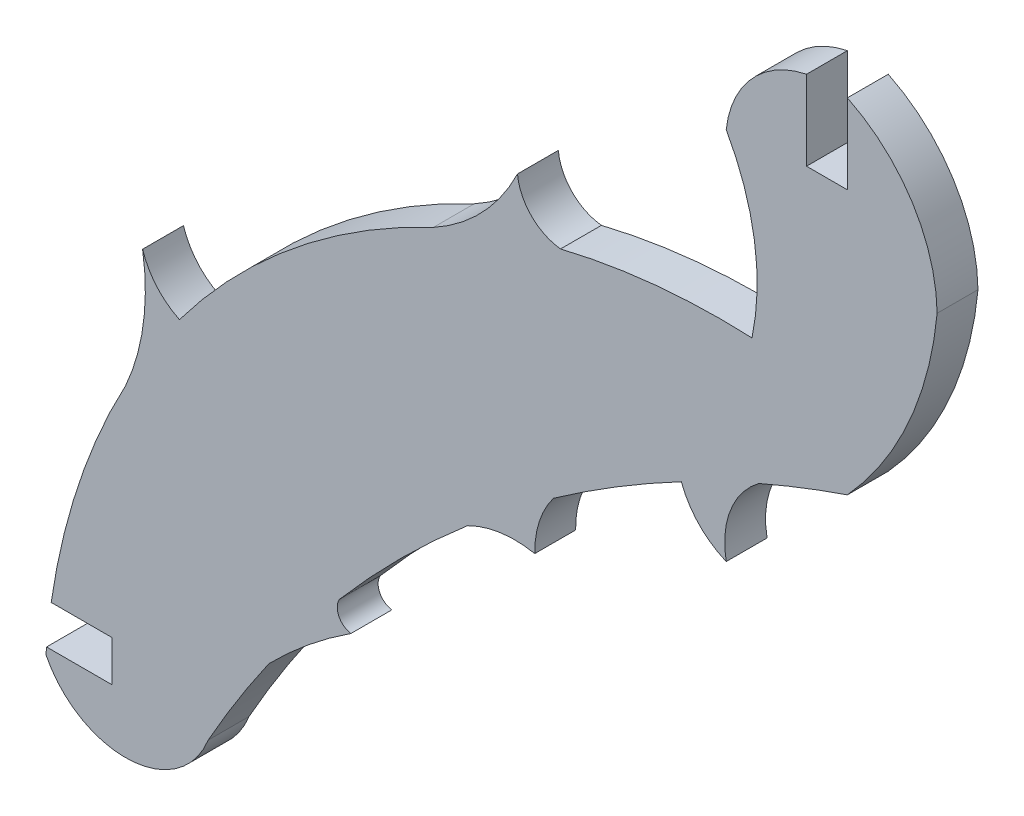
ISO-10303-21;
HEADER;
FILE_DESCRIPTION(('STEP AP214'),'2;1');
FILE_NAME('part.step','',(''),(''),'','','');
FILE_SCHEMA(('AUTOMOTIVE_DESIGN { 1 0 10303 214 1 1 1 1 }'));
ENDSEC;
DATA;
#1=APPLICATION_CONTEXT('core data for automotive mechanical design processes');
#2=APPLICATION_PROTOCOL_DEFINITION('international standard','automotive_design',2000,#1);
#3=PRODUCT_CONTEXT('',#1,'mechanical');
#4=PRODUCT('Part','Part','',(#3));
#5=PRODUCT_RELATED_PRODUCT_CATEGORY('part','',(#4));
#6=PRODUCT_DEFINITION_FORMATION('','',#4);
#7=PRODUCT_DEFINITION_CONTEXT('part definition',#1,'design');
#8=PRODUCT_DEFINITION('design','',#6,#7);
#9=PRODUCT_DEFINITION_SHAPE('','',#8);
#10=(LENGTH_UNIT() NAMED_UNIT(*) SI_UNIT(.MILLI.,.METRE.));
#11=(NAMED_UNIT(*) PLANE_ANGLE_UNIT() SI_UNIT($,.RADIAN.));
#12=(NAMED_UNIT(*) SI_UNIT($,.STERADIAN.) SOLID_ANGLE_UNIT());
#13=UNCERTAINTY_MEASURE_WITH_UNIT(LENGTH_MEASURE(1.E-05),#10,'distance_accuracy_value','');
#14=(GEOMETRIC_REPRESENTATION_CONTEXT(3) GLOBAL_UNCERTAINTY_ASSIGNED_CONTEXT((#13)) GLOBAL_UNIT_ASSIGNED_CONTEXT((#10,
#11,#12)) REPRESENTATION_CONTEXT('',''));
#15=CARTESIAN_POINT('',(0.,0.,0.));
#16=DIRECTION('',(0.,0.,1.));
#17=DIRECTION('',(1.,0.,0.));
#18=AXIS2_PLACEMENT_3D('',#15,#16,#17);
#19=CARTESIAN_POINT('',(0.,-11.3041439442934,1.524));
#20=DIRECTION('',(-1.,0.,0.));
#21=DIRECTION('',(0.,0.,1.));
#22=AXIS2_PLACEMENT_3D('',#19,#20,#21);
#23=PLANE('',#22);
#24=DIRECTION('',(0.,1.,0.));
#25=VECTOR('',#24,1.);
#26=CARTESIAN_POINT('',(0.,-11.3041439442934,0.));
#27=LINE('',#26,#25);
#28=CARTESIAN_POINT('',(0.,-11.3041439442934,0.));
#29=VERTEX_POINT('',#28);
#30=CARTESIAN_POINT('',(0.,-8.33308590148363,0.));
#31=VERTEX_POINT('',#30);
#32=EDGE_CURVE('E257',#29,#31,#27,.T.);
#33=ORIENTED_EDGE('',*,*,#32,.T.);
#34=DIRECTION('',(0.,0.,-1.));
#35=VECTOR('',#34,1.);
#36=CARTESIAN_POINT('',(0.,-8.33308590148363,1.524));
#37=LINE('',#36,#35);
#38=CARTESIAN_POINT('',(0.,-8.33308590148363,1.524));
#39=VERTEX_POINT('',#38);
#40=EDGE_CURVE('E11',#39,#31,#37,.T.);
#41=ORIENTED_EDGE('',*,*,#40,.F.);
#42=DIRECTION('',(0.,1.,0.));
#43=VECTOR('',#42,1.);
#44=CARTESIAN_POINT('',(0.,-11.3041439442934,1.524));
#45=LINE('',#44,#43);
#46=CARTESIAN_POINT('',(0.,-11.3041439442934,1.524));
#47=VERTEX_POINT('',#46);
#48=EDGE_CURVE('E313',#47,#39,#45,.T.);
#49=ORIENTED_EDGE('',*,*,#48,.F.);
#50=DIRECTION('',(0.,0.,-1.));
#51=VECTOR('',#50,1.);
#52=CARTESIAN_POINT('',(0.,-11.3041439442934,1.524));
#53=LINE('',#52,#51);
#54=EDGE_CURVE('E253',#47,#29,#53,.T.);
#55=ORIENTED_EDGE('',*,*,#54,.T.);
#56=EDGE_LOOP('',(#33,#41,#49,#55));
#57=FACE_BOUND('',#56,.T.);
#58=ADVANCED_FACE('F35',(#57),#23,.F.);
#59=CARTESIAN_POINT('',(0.755216560375868,-12.0296324122068,1.524));
#60=DIRECTION('',(0.,0.,-1.));
#61=DIRECTION('',(-1.,0.,0.));
#62=AXIS2_PLACEMENT_3D('',#59,#60,#61);
#63=CYLINDRICAL_SURFACE('',#62,3.77290447255236);
#64=CARTESIAN_POINT('',(0.755216560375868,-12.0296324122068,0.));
#65=DIRECTION('',(0.,0.,1.));
#66=DIRECTION('',(1.,0.,0.));
#67=AXIS2_PLACEMENT_3D('',#64,#65,#66);
#68=CIRCLE('',#67,3.77290447255236);
#69=CARTESIAN_POINT('',(-2.99560226956315,-11.6219974480778,0.));
#70=VERTEX_POINT('',#69);
#71=EDGE_CURVE('E260',#31,#70,#68,.T.);
#72=ORIENTED_EDGE('',*,*,#71,.T.);
#73=DIRECTION('',(0.,0.,-1.));
#74=VECTOR('',#73,1.);
#75=CARTESIAN_POINT('',(-2.99560226956315,-11.6219974480778,1.524));
#76=LINE('',#75,#74);
#77=CARTESIAN_POINT('',(-2.99560226956315,-11.6219974480778,1.524));
#78=VERTEX_POINT('',#77);
#79=EDGE_CURVE('E43',#78,#70,#76,.T.);
#80=ORIENTED_EDGE('',*,*,#79,.F.);
#81=CARTESIAN_POINT('',(0.755216560375868,-12.0296324122068,1.524));
#82=DIRECTION('',(0.,0.,1.));
#83=DIRECTION('',(1.,0.,0.));
#84=AXIS2_PLACEMENT_3D('',#81,#82,#83);
#85=CIRCLE('',#84,3.77290447255236);
#86=EDGE_CURVE('E157',#39,#78,#85,.T.);
#87=ORIENTED_EDGE('',*,*,#86,.F.);
#88=ORIENTED_EDGE('',*,*,#40,.T.);
#89=EDGE_LOOP('',(#72,#80,#87,#88));
#90=FACE_BOUND('',#89,.T.);
#91=ADVANCED_FACE('F476',(#90),#63,.T.);
#92=CARTESIAN_POINT('',(-10.7813911690605,-16.0173559439147,1.524));
#93=DIRECTION('',(0.,0.,-1.));
#94=DIRECTION('',(-1.,0.,0.));
#95=AXIS2_PLACEMENT_3D('',#92,#93,#94);
#96=CYLINDRICAL_SURFACE('',#95,8.94078772225703);
#97=CARTESIAN_POINT('',(-10.7813911690605,-16.0173559439147,0.));
#98=DIRECTION('',(0.,0.,-1.));
#99=DIRECTION('',(-1.,0.,0.));
#100=AXIS2_PLACEMENT_3D('',#97,#98,#99);
#101=CIRCLE('',#100,8.94078772225703);
#102=CARTESIAN_POINT('',(-2.03410656988758,-17.8674092500479,0.));
#103=VERTEX_POINT('',#102);
#104=EDGE_CURVE('E262',#70,#103,#101,.T.);
#105=ORIENTED_EDGE('',*,*,#104,.T.);
#106=DIRECTION('',(0.,0.,-1.));
#107=VECTOR('',#106,1.);
#108=CARTESIAN_POINT('',(-2.03410656988758,-17.8674092500479,1.524));
#109=LINE('',#108,#107);
#110=CARTESIAN_POINT('',(-2.03410656988758,-17.8674092500479,1.524));
#111=VERTEX_POINT('',#110);
#112=EDGE_CURVE('E383',#111,#103,#109,.T.);
#113=ORIENTED_EDGE('',*,*,#112,.F.);
#114=CARTESIAN_POINT('',(-10.7813911690605,-16.0173559439147,1.524));
#115=DIRECTION('',(0.,0.,-1.));
#116=DIRECTION('',(-1.,0.,0.));
#117=AXIS2_PLACEMENT_3D('',#114,#115,#116);
#118=CIRCLE('',#117,8.94078772225703);
#119=EDGE_CURVE('E391',#78,#111,#118,.T.);
#120=ORIENTED_EDGE('',*,*,#119,.F.);
#121=ORIENTED_EDGE('',*,*,#79,.T.);
#122=EDGE_LOOP('',(#105,#113,#120,#121));
#123=FACE_BOUND('',#122,.T.);
#124=ADVANCED_FACE('F389',(#123),#96,.F.);
#125=CARTESIAN_POINT('',(-3.17782265749849,-43.0957114440995,1.524));
#126=DIRECTION('',(0.,0.,-1.));
#127=DIRECTION('',(-1.,0.,0.));
#128=AXIS2_PLACEMENT_3D('',#125,#126,#127);
#129=CYLINDRICAL_SURFACE('',#128,25.2542138678568);
#130=CARTESIAN_POINT('',(-3.17782265749849,-43.0957114440995,0.));
#131=DIRECTION('',(0.,0.,1.));
#132=DIRECTION('',(1.,0.,0.));
#133=AXIS2_PLACEMENT_3D('',#130,#131,#132);
#134=CIRCLE('',#133,25.2542138678568);
#135=CARTESIAN_POINT('',(-9.17476837390818,-18.5638554165201,0.));
#136=VERTEX_POINT('',#135);
#137=EDGE_CURVE('E264',#103,#136,#134,.T.);
#138=ORIENTED_EDGE('',*,*,#137,.T.);
#139=DIRECTION('',(0.,0.,-1.));
#140=VECTOR('',#139,1.);
#141=CARTESIAN_POINT('',(-9.17476837390818,-18.5638554165201,1.524));
#142=LINE('',#141,#140);
#143=CARTESIAN_POINT('',(-9.17476837390818,-18.5638554165201,1.524));
#144=VERTEX_POINT('',#143);
#145=EDGE_CURVE('E380',#144,#136,#142,.T.);
#146=ORIENTED_EDGE('',*,*,#145,.F.);
#147=CARTESIAN_POINT('',(-3.17782265749849,-43.0957114440995,1.524));
#148=DIRECTION('',(0.,0.,1.));
#149=DIRECTION('',(1.,0.,0.));
#150=AXIS2_PLACEMENT_3D('',#147,#148,#149);
#151=CIRCLE('',#150,25.2542138678568);
#152=EDGE_CURVE('E409',#111,#144,#151,.T.);
#153=ORIENTED_EDGE('',*,*,#152,.F.);
#154=ORIENTED_EDGE('',*,*,#112,.T.);
#155=EDGE_LOOP('',(#138,#146,#153,#154));
#156=FACE_BOUND('',#155,.T.);
#157=ADVANCED_FACE('F400',(#156),#129,.T.);
#158=CARTESIAN_POINT('',(-8.97997491233345,-16.7638827962595,1.524));
#159=DIRECTION('',(0.,0.,-1.));
#160=DIRECTION('',(-1.,0.,0.));
#161=AXIS2_PLACEMENT_3D('',#158,#159,#160);
#162=CYLINDRICAL_SURFACE('',#161,1.81048223585877);
#163=CARTESIAN_POINT('',(-8.97997491233345,-16.7638827962595,0.));
#164=DIRECTION('',(0.,0.,-1.));
#165=DIRECTION('',(1.,0.,0.));
#166=AXIS2_PLACEMENT_3D('',#163,#164,#165);
#167=CIRCLE('',#166,1.81048223585877);
#168=CARTESIAN_POINT('',(-10.7813911690605,-16.9448396871472,0.));
#169=VERTEX_POINT('',#168);
#170=EDGE_CURVE('E266',#136,#169,#167,.T.);
#171=ORIENTED_EDGE('',*,*,#170,.T.);
#172=DIRECTION('',(0.,0.,-1.));
#173=VECTOR('',#172,1.);
#174=CARTESIAN_POINT('',(-10.7813911690605,-16.9448396871472,1.524));
#175=LINE('',#174,#173);
#176=CARTESIAN_POINT('',(-10.7813911690605,-16.9448396871472,1.524));
#177=VERTEX_POINT('',#176);
#178=EDGE_CURVE('E377',#177,#169,#175,.T.);
#179=ORIENTED_EDGE('',*,*,#178,.F.);
#180=CARTESIAN_POINT('',(-8.97997491233345,-16.7638827962595,1.524));
#181=DIRECTION('',(0.,0.,-1.));
#182=DIRECTION('',(1.,0.,0.));
#183=AXIS2_PLACEMENT_3D('',#180,#181,#182);
#184=CIRCLE('',#183,1.81048223585877);
#185=EDGE_CURVE('E406',#144,#177,#184,.T.);
#186=ORIENTED_EDGE('',*,*,#185,.F.);
#187=ORIENTED_EDGE('',*,*,#145,.T.);
#188=EDGE_LOOP('',(#171,#179,#186,#187));
#189=FACE_BOUND('',#188,.T.);
#190=ADVANCED_FACE('F404',(#189),#162,.F.);
#191=CARTESIAN_POINT('',(-17.4800403069601,-13.7069369442518,1.524));
#192=DIRECTION('',(0.,0.,-1.));
#193=DIRECTION('',(-1.,0.,0.));
#194=AXIS2_PLACEMENT_3D('',#191,#192,#193);
#195=CYLINDRICAL_SURFACE('',#194,7.44015553904171);
#196=CARTESIAN_POINT('',(-17.4800403069601,-13.7069369442518,0.));
#197=DIRECTION('',(0.,0.,-1.));
#198=DIRECTION('',(1.,0.,0.));
#199=AXIS2_PLACEMENT_3D('',#196,#197,#198);
#200=CIRCLE('',#199,7.44015553904171);
#201=CARTESIAN_POINT('',(-13.9196213224826,-20.2398789384918,0.));
#202=VERTEX_POINT('',#201);
#203=EDGE_CURVE('E268',#169,#202,#200,.T.);
#204=ORIENTED_EDGE('',*,*,#203,.T.);
#205=DIRECTION('',(0.,0.,-1.));
#206=VECTOR('',#205,1.);
#207=CARTESIAN_POINT('',(-13.9196213224826,-20.2398789384918,1.524));
#208=LINE('',#207,#206);
#209=CARTESIAN_POINT('',(-13.9196213224826,-20.2398789384918,1.524));
#210=VERTEX_POINT('',#209);
#211=EDGE_CURVE('E374',#210,#202,#208,.T.);
#212=ORIENTED_EDGE('',*,*,#211,.F.);
#213=CARTESIAN_POINT('',(-17.4800403069601,-13.7069369442518,1.524));
#214=DIRECTION('',(0.,0.,-1.));
#215=DIRECTION('',(1.,0.,0.));
#216=AXIS2_PLACEMENT_3D('',#213,#214,#215);
#217=CIRCLE('',#216,7.44015553904171);
#218=EDGE_CURVE('E408',#177,#210,#217,.T.);
#219=ORIENTED_EDGE('',*,*,#218,.F.);
#220=ORIENTED_EDGE('',*,*,#178,.T.);
#221=EDGE_LOOP('',(#204,#212,#219,#220));
#222=FACE_BOUND('',#221,.T.);
#223=ADVANCED_FACE('F489',(#222),#195,.F.);
#224=CARTESIAN_POINT('',(-3.17782265749849,-43.0957114440995,1.524));
#225=DIRECTION('',(0.,0.,-1.));
#226=DIRECTION('',(-1.,0.,0.));
#227=AXIS2_PLACEMENT_3D('',#224,#225,#226);
#228=CYLINDRICAL_SURFACE('',#227,25.2542138678568);
#229=CARTESIAN_POINT('',(-3.17782265749849,-43.0957114440995,0.));
#230=DIRECTION('',(0.,0.,1.));
#231=DIRECTION('',(1.,0.,0.));
#232=AXIS2_PLACEMENT_3D('',#229,#230,#231);
#233=CIRCLE('',#232,25.2542138678568);
#234=CARTESIAN_POINT('',(-23.3892899941965,-27.9539841258231,0.));
#235=VERTEX_POINT('',#234);
#236=EDGE_CURVE('E270',#202,#235,#233,.T.);
#237=ORIENTED_EDGE('',*,*,#236,.T.);
#238=DIRECTION('',(0.,0.,-1.));
#239=VECTOR('',#238,1.);
#240=CARTESIAN_POINT('',(-23.3892899941965,-27.9539841258231,1.524));
#241=LINE('',#240,#239);
#242=CARTESIAN_POINT('',(-23.3892899941965,-27.9539841258231,1.524));
#243=VERTEX_POINT('',#242);
#244=EDGE_CURVE('E371',#243,#235,#241,.T.);
#245=ORIENTED_EDGE('',*,*,#244,.F.);
#246=CARTESIAN_POINT('',(-3.17782265749849,-43.0957114440995,1.524));
#247=DIRECTION('',(0.,0.,1.));
#248=DIRECTION('',(1.,0.,0.));
#249=AXIS2_PLACEMENT_3D('',#246,#247,#248);
#250=CIRCLE('',#249,25.2542138678568);
#251=EDGE_CURVE('E411',#210,#243,#250,.T.);
#252=ORIENTED_EDGE('',*,*,#251,.F.);
#253=ORIENTED_EDGE('',*,*,#211,.T.);
#254=EDGE_LOOP('',(#237,#245,#252,#253));
#255=FACE_BOUND('',#254,.T.);
#256=ADVANCED_FACE('F492',(#255),#228,.T.);
#257=CARTESIAN_POINT('',(-22.2468983267046,-25.5773732552918,1.524));
#258=DIRECTION('',(0.,0.,-1.));
#259=DIRECTION('',(-1.,0.,0.));
#260=AXIS2_PLACEMENT_3D('',#257,#258,#259);
#261=CYLINDRICAL_SURFACE('',#260,2.63691826795644);
#262=CARTESIAN_POINT('',(-22.2468983267046,-25.5773732552918,0.));
#263=DIRECTION('',(0.,0.,-1.));
#264=DIRECTION('',(1.,0.,0.));
#265=AXIS2_PLACEMENT_3D('',#262,#263,#264);
#266=CIRCLE('',#265,2.63691826795644);
#267=CARTESIAN_POINT('',(-24.7631698810396,-26.3658625809817,0.));
#268=VERTEX_POINT('',#267);
#269=EDGE_CURVE('E272',#235,#268,#266,.T.);
#270=ORIENTED_EDGE('',*,*,#269,.T.);
#271=DIRECTION('',(0.,0.,-1.));
#272=VECTOR('',#271,1.);
#273=CARTESIAN_POINT('',(-24.7631698810396,-26.3658625809817,1.524));
#274=LINE('',#273,#272);
#275=CARTESIAN_POINT('',(-24.7631698810396,-26.3658625809817,1.524));
#276=VERTEX_POINT('',#275);
#277=EDGE_CURVE('E368',#276,#268,#274,.T.);
#278=ORIENTED_EDGE('',*,*,#277,.F.);
#279=CARTESIAN_POINT('',(-22.2468983267046,-25.5773732552918,1.524));
#280=DIRECTION('',(0.,0.,-1.));
#281=DIRECTION('',(1.,0.,0.));
#282=AXIS2_PLACEMENT_3D('',#279,#280,#281);
#283=CIRCLE('',#282,2.63691826795644);
#284=EDGE_CURVE('E417',#243,#276,#283,.T.);
#285=ORIENTED_EDGE('',*,*,#284,.F.);
#286=ORIENTED_EDGE('',*,*,#244,.T.);
#287=EDGE_LOOP('',(#270,#278,#285,#286));
#288=FACE_BOUND('',#287,.T.);
#289=ADVANCED_FACE('F496',(#288),#261,.F.);
#290=CARTESIAN_POINT('',(-33.0044762156134,-27.6650075554394,1.524));
#291=DIRECTION('',(0.,0.,-1.));
#292=DIRECTION('',(-1.,0.,0.));
#293=AXIS2_PLACEMENT_3D('',#290,#291,#292);
#294=CYLINDRICAL_SURFACE('',#293,8.34307543804705);
#295=CARTESIAN_POINT('',(-33.0044762156134,-27.6650075554394,0.));
#296=DIRECTION('',(0.,0.,-1.));
#297=DIRECTION('',(1.,0.,0.));
#298=AXIS2_PLACEMENT_3D('',#295,#296,#297);
#299=CIRCLE('',#298,8.34307543804705);
#300=CARTESIAN_POINT('',(-25.4020703755055,-31.1016240902359,0.));
#301=VERTEX_POINT('',#300);
#302=EDGE_CURVE('E274',#268,#301,#299,.T.);
#303=ORIENTED_EDGE('',*,*,#302,.T.);
#304=DIRECTION('',(0.,0.,-1.));
#305=VECTOR('',#304,1.);
#306=CARTESIAN_POINT('',(-25.4020703755055,-31.1016240902359,1.524));
#307=LINE('',#306,#305);
#308=CARTESIAN_POINT('',(-25.4020703755055,-31.1016240902359,1.524));
#309=VERTEX_POINT('',#308);
#310=EDGE_CURVE('E365',#309,#301,#307,.T.);
#311=ORIENTED_EDGE('',*,*,#310,.F.);
#312=CARTESIAN_POINT('',(-33.0044762156134,-27.6650075554394,1.524));
#313=DIRECTION('',(0.,0.,-1.));
#314=DIRECTION('',(1.,0.,0.));
#315=AXIS2_PLACEMENT_3D('',#312,#313,#314);
#316=CIRCLE('',#315,8.34307543804705);
#317=EDGE_CURVE('E419',#276,#309,#316,.T.);
#318=ORIENTED_EDGE('',*,*,#317,.F.);
#319=ORIENTED_EDGE('',*,*,#277,.T.);
#320=EDGE_LOOP('',(#303,#311,#318,#319));
#321=FACE_BOUND('',#320,.T.);
#322=ADVANCED_FACE('F500',(#321),#294,.F.);
#323=CARTESIAN_POINT('',(-3.17782265749849,-43.0957114440995,1.524));
#324=DIRECTION('',(0.,0.,-1.));
#325=DIRECTION('',(-1.,0.,0.));
#326=AXIS2_PLACEMENT_3D('',#323,#324,#325);
#327=CYLINDRICAL_SURFACE('',#326,25.2542138678568);
#328=CARTESIAN_POINT('',(-3.17782265749849,-43.0957114440995,0.));
#329=DIRECTION('',(0.,0.,1.));
#330=DIRECTION('',(1.,0.,0.));
#331=AXIS2_PLACEMENT_3D('',#328,#329,#330);
#332=CIRCLE('',#331,25.2542138678568);
#333=CARTESIAN_POINT('',(-28.1719824429446,-39.4808401181685,0.));
#334=VERTEX_POINT('',#333);
#335=EDGE_CURVE('E276',#301,#334,#332,.T.);
#336=ORIENTED_EDGE('',*,*,#335,.T.);
#337=DIRECTION('',(0.,0.,-1.));
#338=VECTOR('',#337,1.);
#339=CARTESIAN_POINT('',(-28.1719824429446,-39.4808401181685,1.524));
#340=LINE('',#339,#338);
#341=CARTESIAN_POINT('',(-28.1719824429446,-39.4808401181685,1.524));
#342=VERTEX_POINT('',#341);
#343=EDGE_CURVE('E362',#342,#334,#340,.T.);
#344=ORIENTED_EDGE('',*,*,#343,.F.);
#345=CARTESIAN_POINT('',(-3.17782265749849,-43.0957114440995,1.524));
#346=DIRECTION('',(0.,0.,1.));
#347=DIRECTION('',(1.,0.,0.));
#348=AXIS2_PLACEMENT_3D('',#345,#346,#347);
#349=CIRCLE('',#348,25.2542138678568);
#350=EDGE_CURVE('E421',#309,#342,#349,.T.);
#351=ORIENTED_EDGE('',*,*,#350,.F.);
#352=ORIENTED_EDGE('',*,*,#310,.T.);
#353=EDGE_LOOP('',(#336,#344,#351,#352));
#354=FACE_BOUND('',#353,.T.);
#355=ADVANCED_FACE('F504',(#354),#327,.T.);
#356=CARTESIAN_POINT('',(-25.8998757939656,-39.4808401181685,1.524));
#357=DIRECTION('',(0.,1.,0.));
#358=DIRECTION('',(0.,0.,1.));
#359=AXIS2_PLACEMENT_3D('',#356,#357,#358);
#360=PLANE('',#359);
#361=DIRECTION('',(1.,0.,0.));
#362=VECTOR('',#361,1.);
#363=CARTESIAN_POINT('',(-25.8998757939656,-39.4808401181685,0.));
#364=LINE('',#363,#362);
#365=CARTESIAN_POINT('',(-25.8998757939656,-39.4808401181685,0.));
#366=VERTEX_POINT('',#365);
#367=EDGE_CURVE('E278',#334,#366,#364,.T.);
#368=ORIENTED_EDGE('',*,*,#367,.T.);
#369=DIRECTION('',(0.,0.,-1.));
#370=VECTOR('',#369,1.);
#371=CARTESIAN_POINT('',(-25.8998757939656,-39.4808401181685,1.524));
#372=LINE('',#371,#370);
#373=CARTESIAN_POINT('',(-25.8998757939656,-39.4808401181685,1.524));
#374=VERTEX_POINT('',#373);
#375=EDGE_CURVE('E359',#374,#366,#372,.T.);
#376=ORIENTED_EDGE('',*,*,#375,.F.);
#377=DIRECTION('',(1.,0.,0.));
#378=VECTOR('',#377,1.);
#379=CARTESIAN_POINT('',(-25.8998757939656,-39.4808401181685,1.524));
#380=LINE('',#379,#378);
#381=EDGE_CURVE('E423',#342,#374,#380,.T.);
#382=ORIENTED_EDGE('',*,*,#381,.F.);
#383=ORIENTED_EDGE('',*,*,#343,.T.);
#384=EDGE_LOOP('',(#368,#376,#382,#383));
#385=FACE_BOUND('',#384,.T.);
#386=ADVANCED_FACE('F508',(#385),#360,.F.);
#387=CARTESIAN_POINT('',(-25.8998757939656,-39.4808401181685,1.524));
#388=DIRECTION('',(1.,0.,0.));
#389=DIRECTION('',(0.,0.,-1.));
#390=AXIS2_PLACEMENT_3D('',#387,#388,#389);
#391=PLANE('',#390);
#392=DIRECTION('',(0.,-1.,0.));
#393=VECTOR('',#392,1.);
#394=CARTESIAN_POINT('',(-25.8998757939656,-39.4808401181685,0.));
#395=LINE('',#394,#393);
#396=CARTESIAN_POINT('',(-25.8998757939656,-41.0048401181684,0.));
#397=VERTEX_POINT('',#396);
#398=EDGE_CURVE('E280',#366,#397,#395,.T.);
#399=ORIENTED_EDGE('',*,*,#398,.T.);
#400=DIRECTION('',(0.,0.,-1.));
#401=VECTOR('',#400,1.);
#402=CARTESIAN_POINT('',(-25.8998757939656,-41.0048401181684,1.524));
#403=LINE('',#402,#401);
#404=CARTESIAN_POINT('',(-25.8998757939656,-41.0048401181684,1.524));
#405=VERTEX_POINT('',#404);
#406=EDGE_CURVE('E356',#405,#397,#403,.T.);
#407=ORIENTED_EDGE('',*,*,#406,.F.);
#408=DIRECTION('',(0.,-1.,0.));
#409=VECTOR('',#408,1.);
#410=CARTESIAN_POINT('',(-25.8998757939656,-39.4808401181685,1.524));
#411=LINE('',#410,#409);
#412=EDGE_CURVE('E425',#374,#405,#411,.T.);
#413=ORIENTED_EDGE('',*,*,#412,.F.);
#414=ORIENTED_EDGE('',*,*,#375,.T.);
#415=EDGE_LOOP('',(#399,#407,#413,#414));
#416=FACE_BOUND('',#415,.T.);
#417=ADVANCED_FACE('F512',(#416),#391,.F.);
#418=CARTESIAN_POINT('',(-25.8998757939656,-41.0048401181684,1.524));
#419=DIRECTION('',(0.,-1.,0.));
#420=DIRECTION('',(0.,0.,-1.));
#421=AXIS2_PLACEMENT_3D('',#418,#419,#420);
#422=PLANE('',#421);
#423=DIRECTION('',(-1.,0.,0.));
#424=VECTOR('',#423,1.);
#425=CARTESIAN_POINT('',(-25.8998757939656,-41.0048401181684,0.));
#426=LINE('',#425,#424);
#427=CARTESIAN_POINT('',(-28.3453329670593,-41.0048401181684,0.));
#428=VERTEX_POINT('',#427);
#429=EDGE_CURVE('E282',#397,#428,#426,.T.);
#430=ORIENTED_EDGE('',*,*,#429,.T.);
#431=DIRECTION('',(0.,0.,-1.));
#432=VECTOR('',#431,1.);
#433=CARTESIAN_POINT('',(-28.3453329670593,-41.0048401181684,1.524));
#434=LINE('',#433,#432);
#435=CARTESIAN_POINT('',(-28.3453329670593,-41.0048401181684,1.524));
#436=VERTEX_POINT('',#435);
#437=EDGE_CURVE('E353',#436,#428,#434,.T.);
#438=ORIENTED_EDGE('',*,*,#437,.F.);
#439=DIRECTION('',(-1.,0.,0.));
#440=VECTOR('',#439,1.);
#441=CARTESIAN_POINT('',(-25.8998757939656,-41.0048401181684,1.524));
#442=LINE('',#441,#440);
#443=EDGE_CURVE('E427',#405,#436,#442,.T.);
#444=ORIENTED_EDGE('',*,*,#443,.F.);
#445=ORIENTED_EDGE('',*,*,#406,.T.);
#446=EDGE_LOOP('',(#430,#438,#444,#445));
#447=FACE_BOUND('',#446,.T.);
#448=ADVANCED_FACE('F516',(#447),#422,.F.);
#449=CARTESIAN_POINT('',(-3.17782265749849,-43.0957114440995,1.524));
#450=DIRECTION('',(0.,0.,-1.));
#451=DIRECTION('',(-1.,0.,0.));
#452=AXIS2_PLACEMENT_3D('',#449,#450,#451);
#453=CYLINDRICAL_SURFACE('',#452,25.2542138678568);
#454=CARTESIAN_POINT('',(-3.17782265749849,-43.0957114440995,0.));
#455=DIRECTION('',(0.,0.,1.));
#456=DIRECTION('',(1.,0.,0.));
#457=AXIS2_PLACEMENT_3D('',#454,#455,#456);
#458=CIRCLE('',#457,25.2542138678568);
#459=CARTESIAN_POINT('',(-28.3660185861934,-41.2708542055391,0.));
#460=VERTEX_POINT('',#459);
#461=EDGE_CURVE('E284',#428,#460,#458,.T.);
#462=ORIENTED_EDGE('',*,*,#461,.T.);
#463=DIRECTION('',(0.,0.,-1.));
#464=VECTOR('',#463,1.);
#465=CARTESIAN_POINT('',(-28.3660185861934,-41.2708542055391,1.524));
#466=LINE('',#465,#464);
#467=CARTESIAN_POINT('',(-28.3660185861934,-41.2708542055391,1.524));
#468=VERTEX_POINT('',#467);
#469=EDGE_CURVE('E350',#468,#460,#466,.T.);
#470=ORIENTED_EDGE('',*,*,#469,.F.);
#471=CARTESIAN_POINT('',(-3.17782265749849,-43.0957114440995,1.524));
#472=DIRECTION('',(0.,0.,1.));
#473=DIRECTION('',(1.,0.,0.));
#474=AXIS2_PLACEMENT_3D('',#471,#472,#473);
#475=CIRCLE('',#474,25.2542138678568);
#476=EDGE_CURVE('E429',#436,#468,#475,.T.);
#477=ORIENTED_EDGE('',*,*,#476,.F.);
#478=ORIENTED_EDGE('',*,*,#437,.T.);
#479=EDGE_LOOP('',(#462,#470,#477,#478));
#480=FACE_BOUND('',#479,.T.);
#481=ADVANCED_FACE('F520',(#480),#453,.T.);
#482=CARTESIAN_POINT('',(-25.4020703755055,-39.8010975966386,1.524));
#483=DIRECTION('',(0.,0.,-1.));
#484=DIRECTION('',(-1.,0.,0.));
#485=AXIS2_PLACEMENT_3D('',#482,#483,#484);
#486=CYLINDRICAL_SURFACE('',#485,3.30834905731653);
#487=CARTESIAN_POINT('',(-25.4020703755055,-39.8010975966386,0.));
#488=DIRECTION('',(0.,0.,1.));
#489=DIRECTION('',(-1.,0.,0.));
#490=AXIS2_PLACEMENT_3D('',#487,#488,#489);
#491=CIRCLE('',#490,3.30834905731653);
#492=CARTESIAN_POINT('',(-22.3204835396515,-41.0048401181684,0.));
#493=VERTEX_POINT('',#492);
#494=EDGE_CURVE('E286',#460,#493,#491,.T.);
#495=ORIENTED_EDGE('',*,*,#494,.T.);
#496=DIRECTION('',(0.,0.,-1.));
#497=VECTOR('',#496,1.);
#498=CARTESIAN_POINT('',(-22.3204835396515,-41.0048401181684,1.524));
#499=LINE('',#498,#497);
#500=CARTESIAN_POINT('',(-22.3204835396515,-41.0048401181684,1.524));
#501=VERTEX_POINT('',#500);
#502=EDGE_CURVE('E347',#501,#493,#499,.T.);
#503=ORIENTED_EDGE('',*,*,#502,.F.);
#504=CARTESIAN_POINT('',(-25.4020703755055,-39.8010975966386,1.524));
#505=DIRECTION('',(0.,0.,1.));
#506=DIRECTION('',(-1.,0.,0.));
#507=AXIS2_PLACEMENT_3D('',#504,#505,#506);
#508=CIRCLE('',#507,3.30834905731653);
#509=EDGE_CURVE('E431',#468,#501,#508,.T.);
#510=ORIENTED_EDGE('',*,*,#509,.F.);
#511=ORIENTED_EDGE('',*,*,#469,.T.);
#512=EDGE_LOOP('',(#495,#503,#510,#511));
#513=FACE_BOUND('',#512,.T.);
#514=ADVANCED_FACE('F524',(#513),#486,.T.);
#515=CARTESIAN_POINT('',(15.6219224847142,-62.3422478845186,1.524));
#516=DIRECTION('',(0.,0.,-1.));
#517=DIRECTION('',(-1.,0.,0.));
#518=AXIS2_PLACEMENT_3D('',#515,#516,#517);
#519=CYLINDRICAL_SURFACE('',#518,43.5305771280984);
#520=CARTESIAN_POINT('',(15.6219224847142,-62.3422478845186,0.));
#521=DIRECTION('',(0.,0.,-1.));
#522=DIRECTION('',(1.,0.,0.));
#523=AXIS2_PLACEMENT_3D('',#520,#521,#522);
#524=CIRCLE('',#523,43.5305771280984);
#525=CARTESIAN_POINT('',(-20.0553947869931,-37.4015145873747,0.));
#526=VERTEX_POINT('',#525);
#527=EDGE_CURVE('E288',#493,#526,#524,.T.);
#528=ORIENTED_EDGE('',*,*,#527,.T.);
#529=DIRECTION('',(0.,0.,-1.));
#530=VECTOR('',#529,1.);
#531=CARTESIAN_POINT('',(-20.0553947869931,-37.4015145873747,1.524));
#532=LINE('',#531,#530);
#533=CARTESIAN_POINT('',(-20.0553947869931,-37.4015145873747,1.524));
#534=VERTEX_POINT('',#533);
#535=EDGE_CURVE('E344',#534,#526,#532,.T.);
#536=ORIENTED_EDGE('',*,*,#535,.F.);
#537=CARTESIAN_POINT('',(15.6219224847142,-62.3422478845186,1.524));
#538=DIRECTION('',(0.,0.,-1.));
#539=DIRECTION('',(1.,0.,0.));
#540=AXIS2_PLACEMENT_3D('',#537,#538,#539);
#541=CIRCLE('',#540,43.5305771280984);
#542=EDGE_CURVE('E433',#501,#534,#541,.T.);
#543=ORIENTED_EDGE('',*,*,#542,.F.);
#544=ORIENTED_EDGE('',*,*,#502,.T.);
#545=EDGE_LOOP('',(#528,#536,#543,#544));
#546=FACE_BOUND('',#545,.T.);
#547=ADVANCED_FACE('F528',(#546),#519,.F.);
#548=CARTESIAN_POINT('',(-7.16732034696037,-50.0191041489627,1.524));
#549=DIRECTION('',(0.,0.,-1.));
#550=DIRECTION('',(-1.,0.,0.));
#551=AXIS2_PLACEMENT_3D('',#548,#549,#550);
#552=CYLINDRICAL_SURFACE('',#551,18.0362421007404);
#553=CARTESIAN_POINT('',(-7.16732034696037,-50.0191041489627,0.));
#554=DIRECTION('',(0.,0.,-1.));
#555=DIRECTION('',(-1.,0.,0.));
#556=AXIS2_PLACEMENT_3D('',#553,#554,#555);
#557=CIRCLE('',#556,18.0362421007404);
#558=CARTESIAN_POINT('',(-16.9924618974741,-34.8938728241569,0.));
#559=VERTEX_POINT('',#558);
#560=EDGE_CURVE('E290',#526,#559,#557,.T.);
#561=ORIENTED_EDGE('',*,*,#560,.T.);
#562=DIRECTION('',(0.,0.,-1.));
#563=VECTOR('',#562,1.);
#564=CARTESIAN_POINT('',(-16.9924618974741,-34.8938728241569,1.524));
#565=LINE('',#564,#563);
#566=CARTESIAN_POINT('',(-16.9924618974741,-34.8938728241569,1.524));
#567=VERTEX_POINT('',#566);
#568=EDGE_CURVE('E341',#567,#559,#565,.T.);
#569=ORIENTED_EDGE('',*,*,#568,.F.);
#570=CARTESIAN_POINT('',(-7.16732034696037,-50.0191041489627,1.524));
#571=DIRECTION('',(0.,0.,-1.));
#572=DIRECTION('',(-1.,0.,0.));
#573=AXIS2_PLACEMENT_3D('',#570,#571,#572);
#574=CIRCLE('',#573,18.0362421007404);
#575=EDGE_CURVE('E435',#534,#567,#574,.T.);
#576=ORIENTED_EDGE('',*,*,#575,.F.);
#577=ORIENTED_EDGE('',*,*,#535,.T.);
#578=EDGE_LOOP('',(#561,#569,#576,#577));
#579=FACE_BOUND('',#578,.T.);
#580=ADVANCED_FACE('F532',(#579),#552,.F.);
#581=CARTESIAN_POINT('',(-16.9034152399063,-34.3012815202384,1.524));
#582=DIRECTION('',(0.,0.,-1.));
#583=DIRECTION('',(-1.,0.,0.));
#584=AXIS2_PLACEMENT_3D('',#581,#582,#583);
#585=CYLINDRICAL_SURFACE('',#584,0.599244324715518);
#586=CARTESIAN_POINT('',(-16.9034152399063,-34.3012815202384,0.));
#587=DIRECTION('',(0.,0.,-1.));
#588=DIRECTION('',(-1.,0.,0.));
#589=AXIS2_PLACEMENT_3D('',#586,#587,#588);
#590=CIRCLE('',#589,0.599244324715518);
#591=CARTESIAN_POINT('',(-17.4282943784338,-34.0121523957242,0.));
#592=VERTEX_POINT('',#591);
#593=EDGE_CURVE('E292',#559,#592,#590,.T.);
#594=ORIENTED_EDGE('',*,*,#593,.T.);
#595=DIRECTION('',(0.,0.,-1.));
#596=VECTOR('',#595,1.);
#597=CARTESIAN_POINT('',(-17.4282943784338,-34.0121523957242,1.524));
#598=LINE('',#597,#596);
#599=CARTESIAN_POINT('',(-17.4282943784338,-34.0121523957242,1.524));
#600=VERTEX_POINT('',#599);
#601=EDGE_CURVE('E338',#600,#592,#598,.T.);
#602=ORIENTED_EDGE('',*,*,#601,.F.);
#603=CARTESIAN_POINT('',(-16.9034152399063,-34.3012815202384,1.524));
#604=DIRECTION('',(0.,0.,-1.));
#605=DIRECTION('',(-1.,0.,0.));
#606=AXIS2_PLACEMENT_3D('',#603,#604,#605);
#607=CIRCLE('',#606,0.599244324715518);
#608=EDGE_CURVE('E437',#567,#600,#607,.T.);
#609=ORIENTED_EDGE('',*,*,#608,.F.);
#610=ORIENTED_EDGE('',*,*,#568,.T.);
#611=EDGE_LOOP('',(#594,#602,#609,#610));
#612=FACE_BOUND('',#611,.T.);
#613=ADVANCED_FACE('F536',(#612),#585,.F.);
#614=CARTESIAN_POINT('',(15.6219224847142,-62.3422478845186,1.524));
#615=DIRECTION('',(0.,0.,-1.));
#616=DIRECTION('',(-1.,0.,0.));
#617=AXIS2_PLACEMENT_3D('',#614,#615,#616);
#618=CYLINDRICAL_SURFACE('',#617,43.5305771280984);
#619=CARTESIAN_POINT('',(15.6219224847142,-62.3422478845186,0.));
#620=DIRECTION('',(0.,0.,-1.));
#621=DIRECTION('',(1.,0.,0.));
#622=AXIS2_PLACEMENT_3D('',#619,#620,#621);
#623=CIRCLE('',#622,43.5305771280984);
#624=CARTESIAN_POINT('',(-12.6456245496251,-29.2385180377666,0.));
#625=VERTEX_POINT('',#624);
#626=EDGE_CURVE('E294',#592,#625,#623,.T.);
#627=ORIENTED_EDGE('',*,*,#626,.T.);
#628=DIRECTION('',(0.,0.,-1.));
#629=VECTOR('',#628,1.);
#630=CARTESIAN_POINT('',(-12.6456245496251,-29.2385180377666,1.524));
#631=LINE('',#630,#629);
#632=CARTESIAN_POINT('',(-12.6456245496251,-29.2385180377666,1.524));
#633=VERTEX_POINT('',#632);
#634=EDGE_CURVE('E335',#633,#625,#631,.T.);
#635=ORIENTED_EDGE('',*,*,#634,.F.);
#636=CARTESIAN_POINT('',(15.6219224847142,-62.3422478845186,1.524));
#637=DIRECTION('',(0.,0.,-1.));
#638=DIRECTION('',(1.,0.,0.));
#639=AXIS2_PLACEMENT_3D('',#636,#637,#638);
#640=CIRCLE('',#639,43.5305771280984);
#641=EDGE_CURVE('E439',#600,#633,#640,.T.);
#642=ORIENTED_EDGE('',*,*,#641,.F.);
#643=ORIENTED_EDGE('',*,*,#601,.T.);
#644=EDGE_LOOP('',(#627,#635,#642,#643));
#645=FACE_BOUND('',#644,.T.);
#646=ADVANCED_FACE('F540',(#645),#618,.F.);
#647=CARTESIAN_POINT('',(-10.8805564229752,-32.6838857392038,1.524));
#648=DIRECTION('',(0.,0.,-1.));
#649=DIRECTION('',(-1.,0.,0.));
#650=AXIS2_PLACEMENT_3D('',#647,#648,#649);
#651=CYLINDRICAL_SURFACE('',#650,3.87117864349122);
#652=CARTESIAN_POINT('',(-10.8805564229752,-32.6838857392038,0.));
#653=DIRECTION('',(0.,0.,-1.));
#654=DIRECTION('',(1.,0.,0.));
#655=AXIS2_PLACEMENT_3D('',#652,#653,#654);
#656=CIRCLE('',#655,3.87117864349122);
#657=CARTESIAN_POINT('',(-10.1357922300859,-28.8850240166858,0.));
#658=VERTEX_POINT('',#657);
#659=EDGE_CURVE('E296',#625,#658,#656,.T.);
#660=ORIENTED_EDGE('',*,*,#659,.T.);
#661=DIRECTION('',(0.,0.,-1.));
#662=VECTOR('',#661,1.);
#663=CARTESIAN_POINT('',(-10.1357922300859,-28.8850240166858,1.524));
#664=LINE('',#663,#662);
#665=CARTESIAN_POINT('',(-10.1357922300859,-28.8850240166858,1.524));
#666=VERTEX_POINT('',#665);
#667=EDGE_CURVE('E332',#666,#658,#664,.T.);
#668=ORIENTED_EDGE('',*,*,#667,.F.);
#669=CARTESIAN_POINT('',(-10.8805564229752,-32.6838857392038,1.524));
#670=DIRECTION('',(0.,0.,-1.));
#671=DIRECTION('',(1.,0.,0.));
#672=AXIS2_PLACEMENT_3D('',#669,#670,#671);
#673=CIRCLE('',#672,3.87117864349122);
#674=EDGE_CURVE('E441',#633,#666,#673,.T.);
#675=ORIENTED_EDGE('',*,*,#674,.F.);
#676=ORIENTED_EDGE('',*,*,#634,.T.);
#677=EDGE_LOOP('',(#660,#668,#675,#676));
#678=FACE_BOUND('',#677,.T.);
#679=ADVANCED_FACE('F544',(#678),#651,.F.);
#680=CARTESIAN_POINT('',(-6.70718522251633,-28.8231309306873,1.524));
#681=DIRECTION('',(0.,0.,-1.));
#682=DIRECTION('',(-1.,0.,0.));
#683=AXIS2_PLACEMENT_3D('',#680,#681,#682);
#684=CYLINDRICAL_SURFACE('',#683,3.42916560790666);
#685=CARTESIAN_POINT('',(-6.70718522251633,-28.8231309306873,0.));
#686=DIRECTION('',(0.,0.,-1.));
#687=DIRECTION('',(1.,0.,0.));
#688=AXIS2_PLACEMENT_3D('',#685,#686,#687);
#689=CIRCLE('',#688,3.42916560790666);
#690=CARTESIAN_POINT('',(-9.43718695830877,-26.7479761680201,0.));
#691=VERTEX_POINT('',#690);
#692=EDGE_CURVE('E298',#658,#691,#689,.T.);
#693=ORIENTED_EDGE('',*,*,#692,.T.);
#694=DIRECTION('',(0.,0.,-1.));
#695=VECTOR('',#694,1.);
#696=CARTESIAN_POINT('',(-9.43718695830877,-26.7479761680201,1.524));
#697=LINE('',#696,#695);
#698=CARTESIAN_POINT('',(-9.43718695830877,-26.7479761680201,1.524));
#699=VERTEX_POINT('',#698);
#700=EDGE_CURVE('E329',#699,#691,#697,.T.);
#701=ORIENTED_EDGE('',*,*,#700,.F.);
#702=CARTESIAN_POINT('',(-6.70718522251633,-28.8231309306873,1.524));
#703=DIRECTION('',(0.,0.,-1.));
#704=DIRECTION('',(1.,0.,0.));
#705=AXIS2_PLACEMENT_3D('',#702,#703,#704);
#706=CIRCLE('',#705,3.42916560790666);
#707=EDGE_CURVE('E443',#666,#699,#706,.T.);
#708=ORIENTED_EDGE('',*,*,#707,.F.);
#709=ORIENTED_EDGE('',*,*,#667,.T.);
#710=EDGE_LOOP('',(#693,#701,#708,#709));
#711=FACE_BOUND('',#710,.T.);
#712=ADVANCED_FACE('F548',(#711),#684,.F.);
#713=CARTESIAN_POINT('',(15.6219224847142,-62.3422478845186,1.524));
#714=DIRECTION('',(0.,0.,-1.));
#715=DIRECTION('',(-1.,0.,0.));
#716=AXIS2_PLACEMENT_3D('',#713,#714,#715);
#717=CYLINDRICAL_SURFACE('',#716,43.5305771280984);
#718=CARTESIAN_POINT('',(15.6219224847142,-62.3422478845186,0.));
#719=DIRECTION('',(0.,0.,-1.));
#720=DIRECTION('',(1.,0.,0.));
#721=AXIS2_PLACEMENT_3D('',#718,#719,#720);
#722=CIRCLE('',#721,43.5305771280984);
#723=CARTESIAN_POINT('',(-4.66933439788829,-23.8302232788248,0.));
#724=VERTEX_POINT('',#723);
#725=EDGE_CURVE('E300',#691,#724,#722,.T.);
#726=ORIENTED_EDGE('',*,*,#725,.T.);
#727=DIRECTION('',(0.,0.,-1.));
#728=VECTOR('',#727,1.);
#729=CARTESIAN_POINT('',(-4.66933439788829,-23.8302232788248,1.524));
#730=LINE('',#729,#728);
#731=CARTESIAN_POINT('',(-4.66933439788829,-23.8302232788248,1.524));
#732=VERTEX_POINT('',#731);
#733=EDGE_CURVE('E326',#732,#724,#730,.T.);
#734=ORIENTED_EDGE('',*,*,#733,.F.);
#735=CARTESIAN_POINT('',(15.6219224847142,-62.3422478845186,1.524));
#736=DIRECTION('',(0.,0.,-1.));
#737=DIRECTION('',(1.,0.,0.));
#738=AXIS2_PLACEMENT_3D('',#735,#736,#737);
#739=CIRCLE('',#738,43.5305771280984);
#740=EDGE_CURVE('E445',#699,#732,#739,.T.);
#741=ORIENTED_EDGE('',*,*,#740,.F.);
#742=ORIENTED_EDGE('',*,*,#700,.T.);
#743=EDGE_LOOP('',(#726,#734,#741,#742));
#744=FACE_BOUND('',#743,.T.);
#745=ADVANCED_FACE('F552',(#744),#717,.F.);
#746=CARTESIAN_POINT('',(-1.84031402749047,-22.7876038362349,1.524));
#747=DIRECTION('',(0.,0.,-1.));
#748=DIRECTION('',(-1.,0.,0.));
#749=AXIS2_PLACEMENT_3D('',#746,#747,#748);
#750=CYLINDRICAL_SURFACE('',#749,3.01503093818164);
#751=CARTESIAN_POINT('',(-1.84031402749047,-22.7876038362349,0.));
#752=DIRECTION('',(0.,0.,1.));
#753=DIRECTION('',(-1.,0.,0.));
#754=AXIS2_PLACEMENT_3D('',#751,#752,#753);
#755=CIRCLE('',#754,3.01503093818164);
#756=CARTESIAN_POINT('',(-2.99560226956315,-25.5725132846588,0.));
#757=VERTEX_POINT('',#756);
#758=EDGE_CURVE('E302',#724,#757,#755,.T.);
#759=ORIENTED_EDGE('',*,*,#758,.T.);
#760=DIRECTION('',(0.,0.,-1.));
#761=VECTOR('',#760,1.);
#762=CARTESIAN_POINT('',(-2.99560226956315,-25.5725132846588,1.524));
#763=LINE('',#762,#761);
#764=CARTESIAN_POINT('',(-2.99560226956315,-25.5725132846588,1.524));
#765=VERTEX_POINT('',#764);
#766=EDGE_CURVE('E323',#765,#757,#763,.T.);
#767=ORIENTED_EDGE('',*,*,#766,.F.);
#768=CARTESIAN_POINT('',(-1.84031402749047,-22.7876038362349,1.524));
#769=DIRECTION('',(0.,0.,1.));
#770=DIRECTION('',(-1.,0.,0.));
#771=AXIS2_PLACEMENT_3D('',#768,#769,#770);
#772=CIRCLE('',#771,3.01503093818164);
#773=EDGE_CURVE('E447',#732,#765,#772,.T.);
#774=ORIENTED_EDGE('',*,*,#773,.F.);
#775=ORIENTED_EDGE('',*,*,#733,.T.);
#776=EDGE_LOOP('',(#759,#767,#774,#775));
#777=FACE_BOUND('',#776,.T.);
#778=ADVANCED_FACE('F556',(#777),#750,.T.);
#779=CARTESIAN_POINT('',(0.109009908860381,-24.9773805377061,1.524));
#780=DIRECTION('',(0.,0.,-1.));
#781=DIRECTION('',(-1.,0.,0.));
#782=AXIS2_PLACEMENT_3D('',#779,#780,#781);
#783=CYLINDRICAL_SURFACE('',#782,3.16113899803713);
#784=CARTESIAN_POINT('',(0.109009908860381,-24.9773805377061,0.));
#785=DIRECTION('',(0.,0.,-1.));
#786=DIRECTION('',(1.,0.,0.));
#787=AXIS2_PLACEMENT_3D('',#784,#785,#786);
#788=CIRCLE('',#787,3.16113899803713);
#789=CARTESIAN_POINT('',(-1.77540365016431,-22.4393132999295,0.));
#790=VERTEX_POINT('',#789);
#791=EDGE_CURVE('E304',#757,#790,#788,.T.);
#792=ORIENTED_EDGE('',*,*,#791,.T.);
#793=DIRECTION('',(0.,0.,-1.));
#794=VECTOR('',#793,1.);
#795=CARTESIAN_POINT('',(-1.77540365016431,-22.4393132999295,1.524));
#796=LINE('',#795,#794);
#797=CARTESIAN_POINT('',(-1.77540365016431,-22.4393132999295,1.524));
#798=VERTEX_POINT('',#797);
#799=EDGE_CURVE('E320',#798,#790,#796,.T.);
#800=ORIENTED_EDGE('',*,*,#799,.F.);
#801=CARTESIAN_POINT('',(0.109009908860381,-24.9773805377061,1.524));
#802=DIRECTION('',(0.,0.,-1.));
#803=DIRECTION('',(1.,0.,0.));
#804=AXIS2_PLACEMENT_3D('',#801,#802,#803);
#805=CIRCLE('',#804,3.16113899803713);
#806=EDGE_CURVE('E449',#765,#798,#805,.T.);
#807=ORIENTED_EDGE('',*,*,#806,.F.);
#808=ORIENTED_EDGE('',*,*,#766,.T.);
#809=EDGE_LOOP('',(#792,#800,#807,#808));
#810=FACE_BOUND('',#809,.T.);
#811=ADVANCED_FACE('F560',(#810),#783,.F.);
#812=CARTESIAN_POINT('',(15.6219224847142,-62.3422478845186,1.524));
#813=DIRECTION('',(0.,0.,-1.));
#814=DIRECTION('',(-1.,0.,0.));
#815=AXIS2_PLACEMENT_3D('',#812,#813,#814);
#816=CYLINDRICAL_SURFACE('',#815,43.5305771280984);
#817=CARTESIAN_POINT('',(15.6219224847142,-62.3422478845186,0.));
#818=DIRECTION('',(0.,0.,-1.));
#819=DIRECTION('',(1.,0.,0.));
#820=AXIS2_PLACEMENT_3D('',#817,#818,#819);
#821=CIRCLE('',#820,43.5305771280984);
#822=CARTESIAN_POINT('',(1.524,-21.1577881124114,0.));
#823=VERTEX_POINT('',#822);
#824=EDGE_CURVE('E306',#790,#823,#821,.T.);
#825=ORIENTED_EDGE('',*,*,#824,.T.);
#826=DIRECTION('',(0.,0.,-1.));
#827=VECTOR('',#826,1.);
#828=CARTESIAN_POINT('',(1.524,-21.1577881124114,1.524));
#829=LINE('',#828,#827);
#830=CARTESIAN_POINT('',(1.524,-21.1577881124114,1.524));
#831=VERTEX_POINT('',#830);
#832=EDGE_CURVE('E317',#831,#823,#829,.T.);
#833=ORIENTED_EDGE('',*,*,#832,.F.);
#834=CARTESIAN_POINT('',(15.6219224847142,-62.3422478845186,1.524));
#835=DIRECTION('',(0.,0.,-1.));
#836=DIRECTION('',(1.,0.,0.));
#837=AXIS2_PLACEMENT_3D('',#834,#835,#836);
#838=CIRCLE('',#837,43.5305771280984);
#839=EDGE_CURVE('E451',#798,#831,#838,.T.);
#840=ORIENTED_EDGE('',*,*,#839,.F.);
#841=ORIENTED_EDGE('',*,*,#799,.T.);
#842=EDGE_LOOP('',(#825,#833,#840,#841));
#843=FACE_BOUND('',#842,.T.);
#844=ADVANCED_FACE('F457',(#843),#816,.F.);
#845=CARTESIAN_POINT('',(-8.03766843316543,-12.3998117657199,1.524));
#846=DIRECTION('',(0.,0.,-1.));
#847=DIRECTION('',(-1.,0.,0.));
#848=AXIS2_PLACEMENT_3D('',#845,#846,#847);
#849=CYLINDRICAL_SURFACE('',#848,12.9664047798532);
#850=CARTESIAN_POINT('',(-8.03766843316543,-12.3998117657199,0.));
#851=DIRECTION('',(0.,0.,1.));
#852=DIRECTION('',(-1.,0.,0.));
#853=AXIS2_PLACEMENT_3D('',#850,#851,#852);
#854=CIRCLE('',#853,12.9664047798532);
#855=CARTESIAN_POINT('',(4.87145260970969,-13.6172873570146,0.));
#856=VERTEX_POINT('',#855);
#857=EDGE_CURVE('E308',#823,#856,#854,.T.);
#858=ORIENTED_EDGE('',*,*,#857,.T.);
#859=DIRECTION('',(0.,0.,-1.));
#860=VECTOR('',#859,1.);
#861=CARTESIAN_POINT('',(4.87145260970969,-13.6172873570146,1.524));
#862=LINE('',#861,#860);
#863=CARTESIAN_POINT('',(4.87145260970969,-13.6172873570146,1.524));
#864=VERTEX_POINT('',#863);
#865=EDGE_CURVE('E248',#864,#856,#862,.T.);
#866=ORIENTED_EDGE('',*,*,#865,.F.);
#867=CARTESIAN_POINT('',(-8.03766843316543,-12.3998117657199,1.524));
#868=DIRECTION('',(0.,0.,1.));
#869=DIRECTION('',(-1.,0.,0.));
#870=AXIS2_PLACEMENT_3D('',#867,#868,#869);
#871=CIRCLE('',#870,12.9664047798532);
#872=EDGE_CURVE('E239',#831,#864,#871,.T.);
#873=ORIENTED_EDGE('',*,*,#872,.F.);
#874=ORIENTED_EDGE('',*,*,#832,.T.);
#875=EDGE_LOOP('',(#858,#866,#873,#874));
#876=FACE_BOUND('',#875,.T.);
#877=ADVANCED_FACE('F461',(#876),#849,.T.);
#878=CARTESIAN_POINT('',(-1.09645695566969,-13.6954793892779,1.524));
#879=DIRECTION('',(0.,0.,-1.));
#880=DIRECTION('',(-1.,0.,0.));
#881=AXIS2_PLACEMENT_3D('',#878,#879,#880);
#882=CYLINDRICAL_SURFACE('',#881,5.96842178255326);
#883=CARTESIAN_POINT('',(-1.09645695566969,-13.6954793892779,0.));
#884=DIRECTION('',(0.,0.,1.));
#885=DIRECTION('',(-1.,0.,0.));
#886=AXIS2_PLACEMENT_3D('',#883,#884,#885);
#887=CIRCLE('',#886,5.96842178255326);
#888=CARTESIAN_POINT('',(1.524,-8.33308590148363,0.));
#889=VERTEX_POINT('',#888);
#890=EDGE_CURVE('E247',#856,#889,#887,.T.);
#891=ORIENTED_EDGE('',*,*,#890,.T.);
#892=DIRECTION('',(0.,0.,-1.));
#893=VECTOR('',#892,1.);
#894=CARTESIAN_POINT('',(1.524,-8.33308590148363,1.524));
#895=LINE('',#894,#893);
#896=CARTESIAN_POINT('',(1.524,-8.33308590148363,1.524));
#897=VERTEX_POINT('',#896);
#898=EDGE_CURVE('E244',#897,#889,#895,.T.);
#899=ORIENTED_EDGE('',*,*,#898,.F.);
#900=CARTESIAN_POINT('',(-1.09645695566969,-13.6954793892779,1.524));
#901=DIRECTION('',(0.,0.,1.));
#902=DIRECTION('',(-1.,0.,0.));
#903=AXIS2_PLACEMENT_3D('',#900,#901,#902);
#904=CIRCLE('',#903,5.96842178255326);
#905=EDGE_CURVE('E233',#864,#897,#904,.T.);
#906=ORIENTED_EDGE('',*,*,#905,.F.);
#907=ORIENTED_EDGE('',*,*,#865,.T.);
#908=EDGE_LOOP('',(#891,#899,#906,#907));
#909=FACE_BOUND('',#908,.T.);
#910=ADVANCED_FACE('F245',(#909),#882,.T.);
#911=CARTESIAN_POINT('',(1.524,-11.3041439442934,1.524));
#912=DIRECTION('',(1.,0.,0.));
#913=DIRECTION('',(0.,0.,-1.));
#914=AXIS2_PLACEMENT_3D('',#911,#912,#913);
#915=PLANE('',#914);
#916=DIRECTION('',(0.,-1.,0.));
#917=VECTOR('',#916,1.);
#918=CARTESIAN_POINT('',(1.524,-11.3041439442934,0.));
#919=LINE('',#918,#917);
#920=CARTESIAN_POINT('',(1.524,-11.3041439442934,0.));
#921=VERTEX_POINT('',#920);
#922=EDGE_CURVE('E143',#889,#921,#919,.T.);
#923=ORIENTED_EDGE('',*,*,#922,.T.);
#924=DIRECTION('',(0.,0.,-1.));
#925=VECTOR('',#924,1.);
#926=CARTESIAN_POINT('',(1.524,-11.3041439442934,1.524));
#927=LINE('',#926,#925);
#928=CARTESIAN_POINT('',(1.524,-11.3041439442934,1.524));
#929=VERTEX_POINT('',#928);
#930=EDGE_CURVE('E249',#929,#921,#927,.T.);
#931=ORIENTED_EDGE('',*,*,#930,.F.);
#932=DIRECTION('',(0.,-1.,0.));
#933=VECTOR('',#932,1.);
#934=CARTESIAN_POINT('',(1.524,-11.3041439442934,1.524));
#935=LINE('',#934,#933);
#936=EDGE_CURVE('E237',#897,#929,#935,.T.);
#937=ORIENTED_EDGE('',*,*,#936,.F.);
#938=ORIENTED_EDGE('',*,*,#898,.T.);
#939=EDGE_LOOP('',(#923,#931,#937,#938));
#940=FACE_BOUND('',#939,.T.);
#941=ADVANCED_FACE('F251',(#940),#915,.F.);
#942=CARTESIAN_POINT('',(0.,-11.3041439442934,1.524));
#943=DIRECTION('',(0.,-1.,0.));
#944=DIRECTION('',(0.,0.,-1.));
#945=AXIS2_PLACEMENT_3D('',#942,#943,#944);
#946=PLANE('',#945);
#947=DIRECTION('',(-1.,0.,0.));
#948=VECTOR('',#947,1.);
#949=CARTESIAN_POINT('',(0.,-11.3041439442934,0.));
#950=LINE('',#949,#948);
#951=EDGE_CURVE('E149',#921,#29,#950,.T.);
#952=ORIENTED_EDGE('',*,*,#951,.T.);
#953=ORIENTED_EDGE('',*,*,#54,.F.);
#954=DIRECTION('',(-1.,0.,0.));
#955=VECTOR('',#954,1.);
#956=CARTESIAN_POINT('',(0.,-11.3041439442934,1.524));
#957=LINE('',#956,#955);
#958=EDGE_CURVE('E51',#929,#47,#957,.T.);
#959=ORIENTED_EDGE('',*,*,#958,.F.);
#960=ORIENTED_EDGE('',*,*,#930,.T.);
#961=EDGE_LOOP('',(#952,#953,#959,#960));
#962=FACE_BOUND('',#961,.T.);
#963=ADVANCED_FACE('F465',(#962),#946,.F.);
#964=CARTESIAN_POINT('',(0.755216560375868,-12.0296324122068,1.524));
#965=DIRECTION('',(0.,0.,1.));
#966=DIRECTION('',(1.,0.,0.));
#967=AXIS2_PLACEMENT_3D('',#964,#965,#966);
#968=PLANE('',#967);
#969=ORIENTED_EDGE('',*,*,#48,.T.);
#970=ORIENTED_EDGE('',*,*,#86,.T.);
#971=ORIENTED_EDGE('',*,*,#119,.T.);
#972=ORIENTED_EDGE('',*,*,#152,.T.);
#973=ORIENTED_EDGE('',*,*,#185,.T.);
#974=ORIENTED_EDGE('',*,*,#218,.T.);
#975=ORIENTED_EDGE('',*,*,#251,.T.);
#976=ORIENTED_EDGE('',*,*,#284,.T.);
#977=ORIENTED_EDGE('',*,*,#317,.T.);
#978=ORIENTED_EDGE('',*,*,#350,.T.);
#979=ORIENTED_EDGE('',*,*,#381,.T.);
#980=ORIENTED_EDGE('',*,*,#412,.T.);
#981=ORIENTED_EDGE('',*,*,#443,.T.);
#982=ORIENTED_EDGE('',*,*,#476,.T.);
#983=ORIENTED_EDGE('',*,*,#509,.T.);
#984=ORIENTED_EDGE('',*,*,#542,.T.);
#985=ORIENTED_EDGE('',*,*,#575,.T.);
#986=ORIENTED_EDGE('',*,*,#608,.T.);
#987=ORIENTED_EDGE('',*,*,#641,.T.);
#988=ORIENTED_EDGE('',*,*,#674,.T.);
#989=ORIENTED_EDGE('',*,*,#707,.T.);
#990=ORIENTED_EDGE('',*,*,#740,.T.);
#991=ORIENTED_EDGE('',*,*,#773,.T.);
#992=ORIENTED_EDGE('',*,*,#806,.T.);
#993=ORIENTED_EDGE('',*,*,#839,.T.);
#994=ORIENTED_EDGE('',*,*,#872,.T.);
#995=ORIENTED_EDGE('',*,*,#905,.T.);
#996=ORIENTED_EDGE('',*,*,#936,.T.);
#997=ORIENTED_EDGE('',*,*,#958,.T.);
#998=EDGE_LOOP('',(#969,#970,#971,#972,#973,#974,#975,#976,#977,#978,#979,#980,#981,#982,#983,
#984,#985,#986,#987,#988,#989,#990,#991,#992,#993,#994,#995,#996,#997));
#999=FACE_BOUND('',#998,.T.);
#1000=ADVANCED_FACE('F235',(#999),#968,.T.);
#1001=CARTESIAN_POINT('',(0.755216560375868,-12.0296324122068,0.));
#1002=DIRECTION('',(0.,0.,1.));
#1003=DIRECTION('',(1.,0.,0.));
#1004=AXIS2_PLACEMENT_3D('',#1001,#1002,#1003);
#1005=PLANE('',#1004);
#1006=ORIENTED_EDGE('',*,*,#32,.F.);
#1007=ORIENTED_EDGE('',*,*,#951,.F.);
#1008=ORIENTED_EDGE('',*,*,#922,.F.);
#1009=ORIENTED_EDGE('',*,*,#890,.F.);
#1010=ORIENTED_EDGE('',*,*,#857,.F.);
#1011=ORIENTED_EDGE('',*,*,#824,.F.);
#1012=ORIENTED_EDGE('',*,*,#791,.F.);
#1013=ORIENTED_EDGE('',*,*,#758,.F.);
#1014=ORIENTED_EDGE('',*,*,#725,.F.);
#1015=ORIENTED_EDGE('',*,*,#692,.F.);
#1016=ORIENTED_EDGE('',*,*,#659,.F.);
#1017=ORIENTED_EDGE('',*,*,#626,.F.);
#1018=ORIENTED_EDGE('',*,*,#593,.F.);
#1019=ORIENTED_EDGE('',*,*,#560,.F.);
#1020=ORIENTED_EDGE('',*,*,#527,.F.);
#1021=ORIENTED_EDGE('',*,*,#494,.F.);
#1022=ORIENTED_EDGE('',*,*,#461,.F.);
#1023=ORIENTED_EDGE('',*,*,#429,.F.);
#1024=ORIENTED_EDGE('',*,*,#398,.F.);
#1025=ORIENTED_EDGE('',*,*,#367,.F.);
#1026=ORIENTED_EDGE('',*,*,#335,.F.);
#1027=ORIENTED_EDGE('',*,*,#302,.F.);
#1028=ORIENTED_EDGE('',*,*,#269,.F.);
#1029=ORIENTED_EDGE('',*,*,#236,.F.);
#1030=ORIENTED_EDGE('',*,*,#203,.F.);
#1031=ORIENTED_EDGE('',*,*,#170,.F.);
#1032=ORIENTED_EDGE('',*,*,#137,.F.);
#1033=ORIENTED_EDGE('',*,*,#104,.F.);
#1034=ORIENTED_EDGE('',*,*,#71,.F.);
#1035=EDGE_LOOP('',(#1006,#1007,#1008,#1009,#1010,#1011,#1012,#1013,#1014,#1015,#1016,#1017,
#1018,#1019,#1020,#1021,#1022,#1023,#1024,#1025,#1026,#1027,#1028,#1029,#1030,#1031,#1032,#1033,#1034));
#1036=FACE_BOUND('',#1035,.T.);
#1037=ADVANCED_FACE('F395',(#1036),#1005,.F.);
#1038=CLOSED_SHELL('',(#58,#91,#124,#157,#190,#223,#256,#289,#322,#355,#386,#417,#448,#481,#514,
#547,#580,#613,#646,#679,#712,#745,#778,#811,#844,#877,#910,#941,#963,#1000,#1037));
#1039=MANIFOLD_SOLID_BREP('B2',#1038);
#1040=ADVANCED_BREP_SHAPE_REPRESENTATION('',(#18,#1039),#14);
#1041=SHAPE_DEFINITION_REPRESENTATION(#9,#1040);
ENDSEC;
END-ISO-10303-21;
